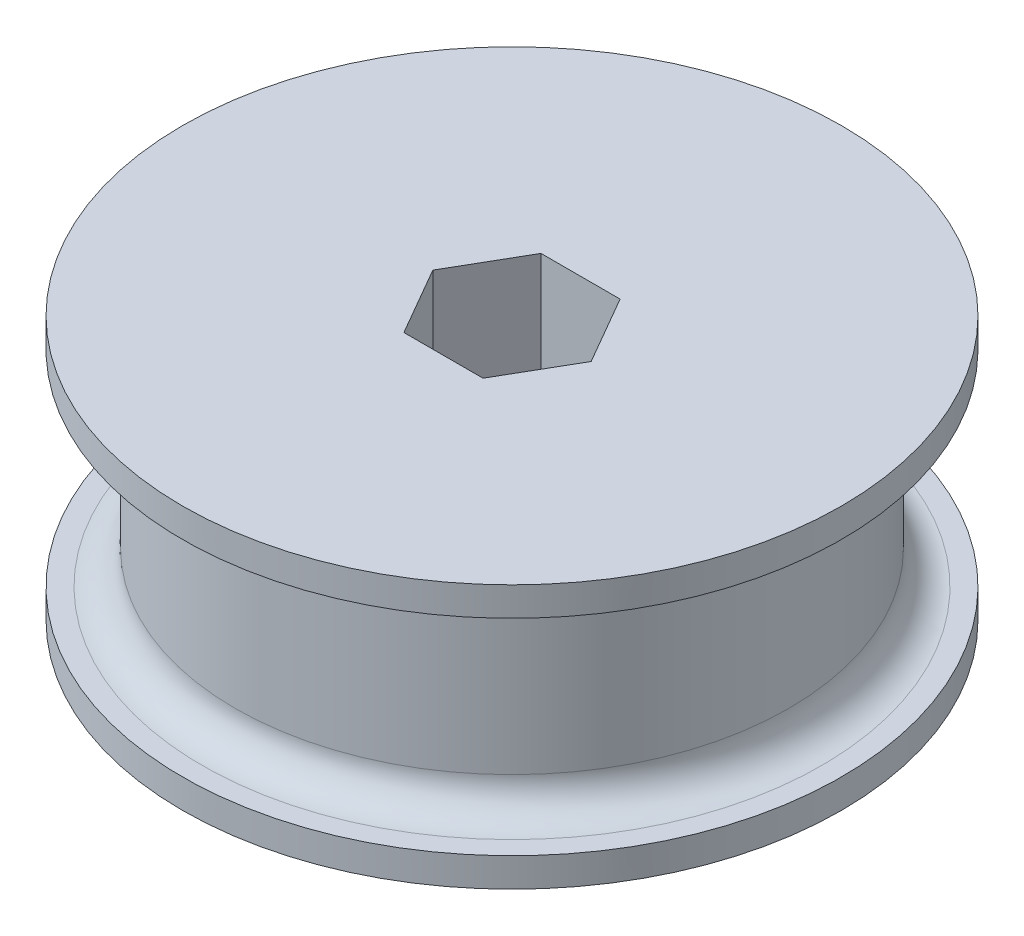
ISO-10303-21;
HEADER;
FILE_DESCRIPTION(('STEP AP214'),'2;1');
FILE_NAME('part.step','',(''),(''),'','','');
FILE_SCHEMA(('AUTOMOTIVE_DESIGN { 1 0 10303 214 1 1 1 1 }'));
ENDSEC;
DATA;
#1=APPLICATION_CONTEXT('core data for automotive mechanical design processes');
#2=APPLICATION_PROTOCOL_DEFINITION('international standard','automotive_design',2000,#1);
#3=PRODUCT_CONTEXT('',#1,'mechanical');
#4=PRODUCT('Part','Part','',(#3));
#5=PRODUCT_RELATED_PRODUCT_CATEGORY('part','',(#4));
#6=PRODUCT_DEFINITION_FORMATION('','',#4);
#7=PRODUCT_DEFINITION_CONTEXT('part definition',#1,'design');
#8=PRODUCT_DEFINITION('design','',#6,#7);
#9=PRODUCT_DEFINITION_SHAPE('','',#8);
#10=(LENGTH_UNIT() NAMED_UNIT(*) SI_UNIT(.MILLI.,.METRE.));
#11=(NAMED_UNIT(*) PLANE_ANGLE_UNIT() SI_UNIT($,.RADIAN.));
#12=(NAMED_UNIT(*) SI_UNIT($,.STERADIAN.) SOLID_ANGLE_UNIT());
#13=UNCERTAINTY_MEASURE_WITH_UNIT(LENGTH_MEASURE(1.E-05),#10,'distance_accuracy_value','');
#14=(GEOMETRIC_REPRESENTATION_CONTEXT(3) GLOBAL_UNCERTAINTY_ASSIGNED_CONTEXT((#13)) GLOBAL_UNIT_ASSIGNED_CONTEXT((#10,
#11,#12)) REPRESENTATION_CONTEXT('',''));
#15=CARTESIAN_POINT('',(0.,0.,0.));
#16=DIRECTION('',(0.,0.,1.));
#17=DIRECTION('',(1.,0.,0.));
#18=AXIS2_PLACEMENT_3D('',#15,#16,#17);
#19=CARTESIAN_POINT('',(0.,25.4,0.));
#20=DIRECTION('',(0.,-1.,0.));
#21=DIRECTION('',(0.,0.,-1.));
#22=AXIS2_PLACEMENT_3D('',#19,#20,#21);
#23=CYLINDRICAL_SURFACE('',#22,31.75);
#24=CARTESIAN_POINT('',(0.,2.794,0.));
#25=DIRECTION('',(0.,-1.,0.));
#26=DIRECTION('',(0.,0.,-1.));
#27=AXIS2_PLACEMENT_3D('',#24,#25,#26);
#28=CIRCLE('',#27,31.75);
#29=CARTESIAN_POINT('',(0.,2.794,-31.75));
#30=VERTEX_POINT('',#29);
#31=EDGE_CURVE('E111',#30,#30,#28,.T.);
#32=ORIENTED_EDGE('',*,*,#31,.T.);
#33=EDGE_LOOP('',(#32));
#34=FACE_BOUND('',#33,.T.);
#35=CARTESIAN_POINT('',(0.,0.,0.));
#36=DIRECTION('',(0.,1.,0.));
#37=DIRECTION('',(0.,0.,1.));
#38=AXIS2_PLACEMENT_3D('',#35,#36,#37);
#39=CIRCLE('',#38,31.75);
#40=CARTESIAN_POINT('',(0.,0.,31.75));
#41=VERTEX_POINT('',#40);
#42=EDGE_CURVE('E37',#41,#41,#39,.T.);
#43=ORIENTED_EDGE('',*,*,#42,.T.);
#44=EDGE_LOOP('',(#43));
#45=FACE_BOUND('',#44,.T.);
#46=ADVANCED_FACE('F33',(#34,#45),#23,.T.);
#47=CARTESIAN_POINT('',(0.,25.4,0.));
#48=DIRECTION('',(0.,1.,0.));
#49=DIRECTION('',(0.,0.,1.));
#50=AXIS2_PLACEMENT_3D('',#47,#48,#49);
#51=PLANE('',#50);
#52=DIRECTION('',(1.,0.,0.));
#53=VECTOR('',#52,1.);
#54=CARTESIAN_POINT('',(-3.81282117772829,25.4,6.604));
#55=LINE('',#54,#53);
#56=CARTESIAN_POINT('',(-3.81282117772829,25.4,6.604));
#57=VERTEX_POINT('',#56);
#58=CARTESIAN_POINT('',(3.81282117772829,25.4,6.604));
#59=VERTEX_POINT('',#58);
#60=EDGE_CURVE('E48',#57,#59,#55,.T.);
#61=ORIENTED_EDGE('',*,*,#60,.F.);
#62=DIRECTION('',(0.5,0.,0.866025403784439));
#63=VECTOR('',#62,1.);
#64=CARTESIAN_POINT('',(-7.62564235545658,25.4,0.));
#65=LINE('',#64,#63);
#66=CARTESIAN_POINT('',(-7.62564235545658,25.4,0.));
#67=VERTEX_POINT('',#66);
#68=EDGE_CURVE('E105',#67,#57,#65,.T.);
#69=ORIENTED_EDGE('',*,*,#68,.F.);
#70=DIRECTION('',(-0.5,0.,0.866025403784439));
#71=VECTOR('',#70,1.);
#72=CARTESIAN_POINT('',(-3.81282117772829,25.4,-6.604));
#73=LINE('',#72,#71);
#74=CARTESIAN_POINT('',(-3.81282117772829,25.4,-6.604));
#75=VERTEX_POINT('',#74);
#76=EDGE_CURVE('E108',#75,#67,#73,.T.);
#77=ORIENTED_EDGE('',*,*,#76,.F.);
#78=DIRECTION('',(-1.,0.,0.));
#79=VECTOR('',#78,1.);
#80=CARTESIAN_POINT('',(3.81282117772829,25.4,-6.604));
#81=LINE('',#80,#79);
#82=CARTESIAN_POINT('',(3.81282117772829,25.4,-6.604));
#83=VERTEX_POINT('',#82);
#84=EDGE_CURVE('E127',#83,#75,#81,.T.);
#85=ORIENTED_EDGE('',*,*,#84,.F.);
#86=DIRECTION('',(-0.5,0.,-0.866025403784439));
#87=VECTOR('',#86,1.);
#88=CARTESIAN_POINT('',(7.62564235545658,25.4,0.));
#89=LINE('',#88,#87);
#90=CARTESIAN_POINT('',(7.62564235545658,25.4,0.));
#91=VERTEX_POINT('',#90);
#92=EDGE_CURVE('E124',#91,#83,#89,.T.);
#93=ORIENTED_EDGE('',*,*,#92,.F.);
#94=DIRECTION('',(0.5,0.,-0.866025403784439));
#95=VECTOR('',#94,1.);
#96=CARTESIAN_POINT('',(3.81282117772829,25.4,6.604));
#97=LINE('',#96,#95);
#98=EDGE_CURVE('E122',#59,#91,#97,.T.);
#99=ORIENTED_EDGE('',*,*,#98,.F.);
#100=EDGE_LOOP('',(#61,#69,#77,#85,#93,#99));
#101=FACE_BOUND('',#100,.T.);
#102=CARTESIAN_POINT('',(0.,25.4,0.));
#103=DIRECTION('',(0.,1.,0.));
#104=DIRECTION('',(0.,0.,1.));
#105=AXIS2_PLACEMENT_3D('',#102,#103,#104);
#106=CIRCLE('',#105,31.75);
#107=CARTESIAN_POINT('',(0.,25.4,31.75));
#108=VERTEX_POINT('',#107);
#109=EDGE_CURVE('E11',#108,#108,#106,.T.);
#110=ORIENTED_EDGE('',*,*,#109,.T.);
#111=EDGE_LOOP('',(#110));
#112=FACE_BOUND('',#111,.T.);
#113=ADVANCED_FACE('F144',(#101,#112),#51,.T.);
#114=CARTESIAN_POINT('',(0.,0.,0.));
#115=DIRECTION('',(0.,1.,0.));
#116=DIRECTION('',(0.,0.,1.));
#117=AXIS2_PLACEMENT_3D('',#114,#115,#116);
#118=PLANE('',#117);
#119=DIRECTION('',(0.5,0.,0.866025403784439));
#120=VECTOR('',#119,1.);
#121=CARTESIAN_POINT('',(-7.62564235545658,0.,0.));
#122=LINE('',#121,#120);
#123=CARTESIAN_POINT('',(-7.62564235545658,0.,0.));
#124=VERTEX_POINT('',#123);
#125=CARTESIAN_POINT('',(-3.81282117772829,0.,6.604));
#126=VERTEX_POINT('',#125);
#127=EDGE_CURVE('E94',#124,#126,#122,.T.);
#128=ORIENTED_EDGE('',*,*,#127,.T.);
#129=DIRECTION('',(1.,0.,0.));
#130=VECTOR('',#129,1.);
#131=CARTESIAN_POINT('',(-3.81282117772829,0.,6.604));
#132=LINE('',#131,#130);
#133=CARTESIAN_POINT('',(3.81282117772829,0.,6.604));
#134=VERTEX_POINT('',#133);
#135=EDGE_CURVE('E88',#126,#134,#132,.T.);
#136=ORIENTED_EDGE('',*,*,#135,.T.);
#137=DIRECTION('',(0.5,0.,-0.866025403784439));
#138=VECTOR('',#137,1.);
#139=CARTESIAN_POINT('',(3.81282117772829,0.,6.604));
#140=LINE('',#139,#138);
#141=CARTESIAN_POINT('',(7.62564235545658,0.,0.));
#142=VERTEX_POINT('',#141);
#143=EDGE_CURVE('E97',#134,#142,#140,.T.);
#144=ORIENTED_EDGE('',*,*,#143,.T.);
#145=DIRECTION('',(-0.5,0.,-0.866025403784439));
#146=VECTOR('',#145,1.);
#147=CARTESIAN_POINT('',(7.62564235545658,0.,0.));
#148=LINE('',#147,#146);
#149=CARTESIAN_POINT('',(3.81282117772829,0.,-6.604));
#150=VERTEX_POINT('',#149);
#151=EDGE_CURVE('E56',#142,#150,#148,.T.);
#152=ORIENTED_EDGE('',*,*,#151,.T.);
#153=DIRECTION('',(-1.,0.,0.));
#154=VECTOR('',#153,1.);
#155=CARTESIAN_POINT('',(3.81282117772829,0.,-6.604));
#156=LINE('',#155,#154);
#157=CARTESIAN_POINT('',(-3.81282117772829,0.,-6.604));
#158=VERTEX_POINT('',#157);
#159=EDGE_CURVE('E115',#150,#158,#156,.T.);
#160=ORIENTED_EDGE('',*,*,#159,.T.);
#161=DIRECTION('',(-0.5,0.,0.866025403784439));
#162=VECTOR('',#161,1.);
#163=CARTESIAN_POINT('',(-3.81282117772829,0.,-6.604));
#164=LINE('',#163,#162);
#165=EDGE_CURVE('E118',#158,#124,#164,.T.);
#166=ORIENTED_EDGE('',*,*,#165,.T.);
#167=EDGE_LOOP('',(#128,#136,#144,#152,#160,#166));
#168=FACE_BOUND('',#167,.T.);
#169=ORIENTED_EDGE('',*,*,#42,.F.);
#170=EDGE_LOOP('',(#169));
#171=FACE_BOUND('',#170,.T.);
#172=ADVANCED_FACE('F101',(#168,#171),#118,.F.);
#173=CARTESIAN_POINT('',(0.,22.606,0.));
#174=DIRECTION('',(0.,-1.,0.));
#175=DIRECTION('',(0.,0.,-1.));
#176=AXIS2_PLACEMENT_3D('',#173,#174,#175);
#177=CIRCLE('',#176,31.75);
#178=CARTESIAN_POINT('',(0.,22.606,-31.75));
#179=VERTEX_POINT('',#178);
#180=EDGE_CURVE('E181',#179,#179,#177,.T.);
#181=ORIENTED_EDGE('',*,*,#180,.F.);
#182=EDGE_LOOP('',(#181));
#183=FACE_BOUND('',#182,.T.);
#184=ORIENTED_EDGE('',*,*,#109,.F.);
#185=EDGE_LOOP('',(#184));
#186=FACE_BOUND('',#185,.T.);
#187=ADVANCED_FACE('F35',(#183,#186),#23,.T.);
#188=CARTESIAN_POINT('',(-3.81282117772829,0.,6.604));
#189=DIRECTION('',(0.,0.,1.));
#190=DIRECTION('',(1.,0.,0.));
#191=AXIS2_PLACEMENT_3D('',#188,#189,#190);
#192=PLANE('',#191);
#193=ORIENTED_EDGE('',*,*,#60,.T.);
#194=DIRECTION('',(0.,1.,0.));
#195=VECTOR('',#194,1.);
#196=CARTESIAN_POINT('',(3.81282117772829,0.,6.604));
#197=LINE('',#196,#195);
#198=EDGE_CURVE('E84',#134,#59,#197,.T.);
#199=ORIENTED_EDGE('',*,*,#198,.F.);
#200=ORIENTED_EDGE('',*,*,#135,.F.);
#201=DIRECTION('',(0.,1.,0.));
#202=VECTOR('',#201,1.);
#203=CARTESIAN_POINT('',(-3.81282117772829,0.,6.604));
#204=LINE('',#203,#202);
#205=EDGE_CURVE('E132',#126,#57,#204,.T.);
#206=ORIENTED_EDGE('',*,*,#205,.T.);
#207=EDGE_LOOP('',(#193,#199,#200,#206));
#208=FACE_BOUND('',#207,.T.);
#209=ADVANCED_FACE('F86',(#208),#192,.F.);
#210=CARTESIAN_POINT('',(-7.62564235545658,0.,0.));
#211=DIRECTION('',(-0.866025403784438,0.,0.5));
#212=DIRECTION('',(0.5,0.,0.866025403784439));
#213=AXIS2_PLACEMENT_3D('',#210,#211,#212);
#214=PLANE('',#213);
#215=ORIENTED_EDGE('',*,*,#68,.T.);
#216=ORIENTED_EDGE('',*,*,#205,.F.);
#217=ORIENTED_EDGE('',*,*,#127,.F.);
#218=DIRECTION('',(0.,1.,0.));
#219=VECTOR('',#218,1.);
#220=CARTESIAN_POINT('',(-7.62564235545658,0.,0.));
#221=LINE('',#220,#219);
#222=EDGE_CURVE('E134',#124,#67,#221,.T.);
#223=ORIENTED_EDGE('',*,*,#222,.T.);
#224=EDGE_LOOP('',(#215,#216,#217,#223));
#225=FACE_BOUND('',#224,.T.);
#226=ADVANCED_FACE('F155',(#225),#214,.F.);
#227=CARTESIAN_POINT('',(-3.81282117772829,0.,-6.604));
#228=DIRECTION('',(-0.866025403784439,0.,-0.5));
#229=DIRECTION('',(-0.5,0.,0.866025403784439));
#230=AXIS2_PLACEMENT_3D('',#227,#228,#229);
#231=PLANE('',#230);
#232=ORIENTED_EDGE('',*,*,#76,.T.);
#233=ORIENTED_EDGE('',*,*,#222,.F.);
#234=ORIENTED_EDGE('',*,*,#165,.F.);
#235=DIRECTION('',(0.,1.,0.));
#236=VECTOR('',#235,1.);
#237=CARTESIAN_POINT('',(-3.81282117772829,0.,-6.604));
#238=LINE('',#237,#236);
#239=EDGE_CURVE('E136',#158,#75,#238,.T.);
#240=ORIENTED_EDGE('',*,*,#239,.T.);
#241=EDGE_LOOP('',(#232,#233,#234,#240));
#242=FACE_BOUND('',#241,.T.);
#243=ADVANCED_FACE('F153',(#242),#231,.F.);
#244=CARTESIAN_POINT('',(3.81282117772829,0.,-6.604));
#245=DIRECTION('',(0.,0.,-1.));
#246=DIRECTION('',(-1.,0.,0.));
#247=AXIS2_PLACEMENT_3D('',#244,#245,#246);
#248=PLANE('',#247);
#249=ORIENTED_EDGE('',*,*,#84,.T.);
#250=ORIENTED_EDGE('',*,*,#239,.F.);
#251=ORIENTED_EDGE('',*,*,#159,.F.);
#252=DIRECTION('',(0.,1.,0.));
#253=VECTOR('',#252,1.);
#254=CARTESIAN_POINT('',(3.81282117772829,0.,-6.604));
#255=LINE('',#254,#253);
#256=EDGE_CURVE('E138',#150,#83,#255,.T.);
#257=ORIENTED_EDGE('',*,*,#256,.T.);
#258=EDGE_LOOP('',(#249,#250,#251,#257));
#259=FACE_BOUND('',#258,.T.);
#260=ADVANCED_FACE('F149',(#259),#248,.F.);
#261=CARTESIAN_POINT('',(7.62564235545658,0.,0.));
#262=DIRECTION('',(0.866025403784438,0.,-0.5));
#263=DIRECTION('',(-0.5,0.,-0.866025403784439));
#264=AXIS2_PLACEMENT_3D('',#261,#262,#263);
#265=PLANE('',#264);
#266=ORIENTED_EDGE('',*,*,#92,.T.);
#267=ORIENTED_EDGE('',*,*,#256,.F.);
#268=ORIENTED_EDGE('',*,*,#151,.F.);
#269=DIRECTION('',(0.,1.,0.));
#270=VECTOR('',#269,1.);
#271=CARTESIAN_POINT('',(7.62564235545658,0.,0.));
#272=LINE('',#271,#270);
#273=EDGE_CURVE('E93',#142,#91,#272,.T.);
#274=ORIENTED_EDGE('',*,*,#273,.T.);
#275=EDGE_LOOP('',(#266,#267,#268,#274));
#276=FACE_BOUND('',#275,.T.);
#277=ADVANCED_FACE('F140',(#276),#265,.F.);
#278=CARTESIAN_POINT('',(3.81282117772829,0.,6.604));
#279=DIRECTION('',(0.866025403784439,0.,0.5));
#280=DIRECTION('',(0.5,0.,-0.866025403784439));
#281=AXIS2_PLACEMENT_3D('',#278,#279,#280);
#282=PLANE('',#281);
#283=ORIENTED_EDGE('',*,*,#98,.T.);
#284=ORIENTED_EDGE('',*,*,#273,.F.);
#285=ORIENTED_EDGE('',*,*,#143,.F.);
#286=ORIENTED_EDGE('',*,*,#198,.T.);
#287=EDGE_LOOP('',(#283,#284,#285,#286));
#288=FACE_BOUND('',#287,.T.);
#289=ADVANCED_FACE('F98',(#288),#282,.F.);
#290=CARTESIAN_POINT('',(31.75,2.794,0.));
#291=DIRECTION('',(0.,-1.,0.));
#292=DIRECTION('',(0.,0.,-1.));
#293=AXIS2_PLACEMENT_3D('',#290,#291,#292);
#294=PLANE('',#293);
#295=ORIENTED_EDGE('',*,*,#31,.F.);
#296=EDGE_LOOP('',(#295));
#297=FACE_BOUND('',#296,.T.);
#298=CARTESIAN_POINT('',(0.,2.794,0.));
#299=DIRECTION('',(0.,-1.,0.));
#300=DIRECTION('',(0.,0.,-1.));
#301=AXIS2_PLACEMENT_3D('',#298,#299,#300);
#302=CIRCLE('',#301,29.845);
#303=CARTESIAN_POINT('',(0.,2.794,-29.845));
#304=VERTEX_POINT('',#303);
#305=EDGE_CURVE('E194',#304,#304,#302,.T.);
#306=ORIENTED_EDGE('',*,*,#305,.T.);
#307=EDGE_LOOP('',(#306));
#308=FACE_BOUND('',#307,.T.);
#309=ADVANCED_FACE('F200',(#297,#308),#294,.F.);
#310=CARTESIAN_POINT('',(0.,5.969,0.));
#311=DIRECTION('',(0.,-1.,0.));
#312=DIRECTION('',(0.,0.,-1.));
#313=AXIS2_PLACEMENT_3D('',#310,#311,#312);
#314=TOROIDAL_SURFACE('',#313,29.845,3.175);
#315=ORIENTED_EDGE('',*,*,#305,.F.);
#316=EDGE_LOOP('',(#315));
#317=FACE_BOUND('',#316,.T.);
#318=CARTESIAN_POINT('',(0.,5.969,0.));
#319=DIRECTION('',(0.,-1.,0.));
#320=DIRECTION('',(0.,0.,-1.));
#321=AXIS2_PLACEMENT_3D('',#318,#319,#320);
#322=CIRCLE('',#321,26.67);
#323=CARTESIAN_POINT('',(0.,5.969,-26.67));
#324=VERTEX_POINT('',#323);
#325=EDGE_CURVE('E192',#324,#324,#322,.T.);
#326=ORIENTED_EDGE('',*,*,#325,.T.);
#327=EDGE_LOOP('',(#326));
#328=FACE_BOUND('',#327,.T.);
#329=ADVANCED_FACE('F202',(#317,#328),#314,.F.);
#330=CARTESIAN_POINT('',(0.,0.,0.));
#331=DIRECTION('',(0.,-1.,0.));
#332=DIRECTION('',(0.,0.,-1.));
#333=AXIS2_PLACEMENT_3D('',#330,#331,#332);
#334=CYLINDRICAL_SURFACE('',#333,26.67);
#335=ORIENTED_EDGE('',*,*,#325,.F.);
#336=EDGE_LOOP('',(#335));
#337=FACE_BOUND('',#336,.T.);
#338=CARTESIAN_POINT('',(0.,19.431,0.));
#339=DIRECTION('',(0.,-1.,0.));
#340=DIRECTION('',(0.,0.,-1.));
#341=AXIS2_PLACEMENT_3D('',#338,#339,#340);
#342=CIRCLE('',#341,26.67);
#343=CARTESIAN_POINT('',(0.,19.431,-26.67));
#344=VERTEX_POINT('',#343);
#345=EDGE_CURVE('E187',#344,#344,#342,.T.);
#346=ORIENTED_EDGE('',*,*,#345,.T.);
#347=EDGE_LOOP('',(#346));
#348=FACE_BOUND('',#347,.T.);
#349=ADVANCED_FACE('F207',(#337,#348),#334,.T.);
#350=CARTESIAN_POINT('',(0.,19.431,0.));
#351=DIRECTION('',(0.,-1.,0.));
#352=DIRECTION('',(0.,0.,-1.));
#353=AXIS2_PLACEMENT_3D('',#350,#351,#352);
#354=TOROIDAL_SURFACE('',#353,29.845,3.175);
#355=ORIENTED_EDGE('',*,*,#345,.F.);
#356=EDGE_LOOP('',(#355));
#357=FACE_BOUND('',#356,.T.);
#358=CARTESIAN_POINT('',(0.,22.606,0.));
#359=DIRECTION('',(0.,-1.,0.));
#360=DIRECTION('',(0.,0.,-1.));
#361=AXIS2_PLACEMENT_3D('',#358,#359,#360);
#362=CIRCLE('',#361,29.845);
#363=CARTESIAN_POINT('',(0.,22.606,-29.845));
#364=VERTEX_POINT('',#363);
#365=EDGE_CURVE('E184',#364,#364,#362,.T.);
#366=ORIENTED_EDGE('',*,*,#365,.T.);
#367=EDGE_LOOP('',(#366));
#368=FACE_BOUND('',#367,.T.);
#369=ADVANCED_FACE('F214',(#357,#368),#354,.F.);
#370=CARTESIAN_POINT('',(31.75,22.606,0.));
#371=DIRECTION('',(0.,1.,0.));
#372=DIRECTION('',(0.,0.,1.));
#373=AXIS2_PLACEMENT_3D('',#370,#371,#372);
#374=PLANE('',#373);
#375=ORIENTED_EDGE('',*,*,#365,.F.);
#376=EDGE_LOOP('',(#375));
#377=FACE_BOUND('',#376,.T.);
#378=ORIENTED_EDGE('',*,*,#180,.T.);
#379=EDGE_LOOP('',(#378));
#380=FACE_BOUND('',#379,.T.);
#381=ADVANCED_FACE('F218',(#377,#380),#374,.F.);
#382=CLOSED_SHELL('',(#46,#113,#172,#187,#209,#226,#243,#260,#277,#289,#309,#329,#349,#369,#381));
#383=MANIFOLD_SOLID_BREP('B2',#382);
#384=ADVANCED_BREP_SHAPE_REPRESENTATION('',(#18,#383),#14);
#385=SHAPE_DEFINITION_REPRESENTATION(#9,#384);
ENDSEC;
END-ISO-10303-21;
